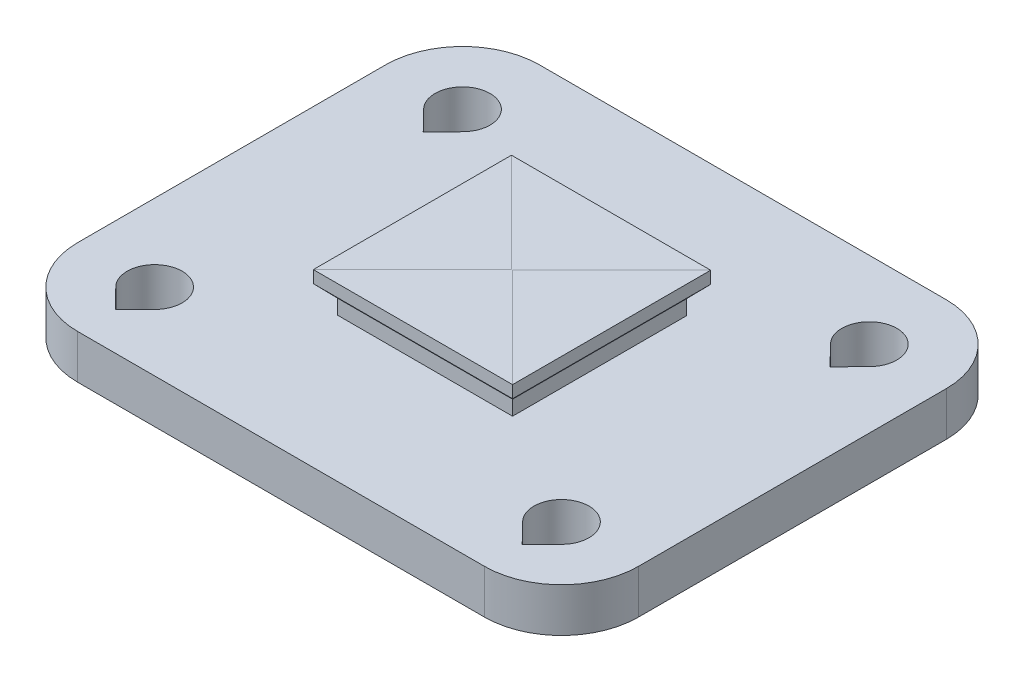
ISO-10303-21;
HEADER;
FILE_DESCRIPTION(('STEP AP214'),'2;1');
FILE_NAME('part.step','',(''),(''),'','','');
FILE_SCHEMA(('AUTOMOTIVE_DESIGN { 1 0 10303 214 1 1 1 1 }'));
ENDSEC;
DATA;
#1=APPLICATION_CONTEXT('core data for automotive mechanical design processes');
#2=APPLICATION_PROTOCOL_DEFINITION('international standard','automotive_design',2000,#1);
#3=PRODUCT_CONTEXT('',#1,'mechanical');
#4=PRODUCT('Part','Part','',(#3));
#5=PRODUCT_RELATED_PRODUCT_CATEGORY('part','',(#4));
#6=PRODUCT_DEFINITION_FORMATION('','',#4);
#7=PRODUCT_DEFINITION_CONTEXT('part definition',#1,'design');
#8=PRODUCT_DEFINITION('design','',#6,#7);
#9=PRODUCT_DEFINITION_SHAPE('','',#8);
#10=(LENGTH_UNIT() NAMED_UNIT(*) SI_UNIT(.MILLI.,.METRE.));
#11=(NAMED_UNIT(*) PLANE_ANGLE_UNIT() SI_UNIT($,.RADIAN.));
#12=(NAMED_UNIT(*) SI_UNIT($,.STERADIAN.) SOLID_ANGLE_UNIT());
#13=UNCERTAINTY_MEASURE_WITH_UNIT(LENGTH_MEASURE(1.E-05),#10,'distance_accuracy_value','');
#14=(GEOMETRIC_REPRESENTATION_CONTEXT(3) GLOBAL_UNCERTAINTY_ASSIGNED_CONTEXT((#13)) GLOBAL_UNIT_ASSIGNED_CONTEXT((#10,
#11,#12)) REPRESENTATION_CONTEXT('',''));
#15=CARTESIAN_POINT('',(0.,0.,0.));
#16=DIRECTION('',(0.,0.,1.));
#17=DIRECTION('',(1.,0.,0.));
#18=AXIS2_PLACEMENT_3D('',#15,#16,#17);
#19=CARTESIAN_POINT('',(18.5,4.211074047634,-10.42685295164));
#20=DIRECTION('',(0.714472679633082,0.,0.699663340513081));
#21=DIRECTION('',(0.,-1.,0.));
#22=AXIS2_PLACEMENT_3D('',#19,#20,#21);
#23=PLANE('',#22);
#24=DIRECTION('',(0.,-1.,0.));
#25=VECTOR('',#24,1.);
#26=CARTESIAN_POINT('',(18.5,0.2,-10.42685295164));
#27=LINE('',#26,#25);
#28=CARTESIAN_POINT('',(18.5,0.2,-10.42685295164));
#29=VERTEX_POINT('',#28);
#30=CARTESIAN_POINT('',(18.5,-3.8,-10.42685295164));
#31=VERTEX_POINT('',#30);
#32=EDGE_CURVE('E9',#29,#31,#27,.T.);
#33=ORIENTED_EDGE('',*,*,#32,.F.);
#34=DIRECTION('',(0.699663340513081,0.,-0.714472679633082));
#35=VECTOR('',#34,1.);
#36=CARTESIAN_POINT('',(18.5,0.2,-10.42685295164));
#37=LINE('',#36,#35);
#38=CARTESIAN_POINT('',(20.286181699082,0.2,-12.25084164871));
#39=VERTEX_POINT('',#38);
#40=EDGE_CURVE('E319',#29,#39,#37,.T.);
#41=ORIENTED_EDGE('',*,*,#40,.T.);
#42=DIRECTION('',(0.,-1.,0.));
#43=VECTOR('',#42,1.);
#44=CARTESIAN_POINT('',(20.286181699082,0.2,-12.25084164871));
#45=LINE('',#44,#43);
#46=CARTESIAN_POINT('',(20.286181699082,-3.8,-12.25084164871));
#47=VERTEX_POINT('',#46);
#48=EDGE_CURVE('E192',#39,#47,#45,.T.);
#49=ORIENTED_EDGE('',*,*,#48,.T.);
#50=DIRECTION('',(0.699663340513081,0.,-0.714472679633082));
#51=VECTOR('',#50,1.);
#52=CARTESIAN_POINT('',(18.5,-3.8,-10.42685295164));
#53=LINE('',#52,#51);
#54=EDGE_CURVE('E371',#31,#47,#53,.T.);
#55=ORIENTED_EDGE('',*,*,#54,.F.);
#56=EDGE_LOOP('',(#33,#41,#49,#55));
#57=FACE_BOUND('',#56,.T.);
#58=ADVANCED_FACE('F15',(#57),#23,.F.);
#59=CARTESIAN_POINT('',(16.713818300918,4.211074047634,-12.25084164871));
#60=DIRECTION('',(-0.714472679633082,0.,0.699663340513081));
#61=DIRECTION('',(0.,1.,0.));
#62=AXIS2_PLACEMENT_3D('',#59,#60,#61);
#63=PLANE('',#62);
#64=DIRECTION('',(0.,-1.,0.));
#65=VECTOR('',#64,1.);
#66=CARTESIAN_POINT('',(16.713818300918,0.2,-12.25084164871));
#67=LINE('',#66,#65);
#68=CARTESIAN_POINT('',(16.713818300918,0.2,-12.25084164871));
#69=VERTEX_POINT('',#68);
#70=CARTESIAN_POINT('',(16.713818300918,-3.8,-12.25084164871));
#71=VERTEX_POINT('',#70);
#72=EDGE_CURVE('E260',#69,#71,#67,.T.);
#73=ORIENTED_EDGE('',*,*,#72,.F.);
#74=DIRECTION('',(0.699663340513081,0.,0.714472679633082));
#75=VECTOR('',#74,1.);
#76=CARTESIAN_POINT('',(16.713818300918,0.2,-12.25084164871));
#77=LINE('',#76,#75);
#78=EDGE_CURVE('E312',#69,#29,#77,.T.);
#79=ORIENTED_EDGE('',*,*,#78,.T.);
#80=ORIENTED_EDGE('',*,*,#32,.T.);
#81=DIRECTION('',(0.699663340513081,0.,0.714472679633082));
#82=VECTOR('',#81,1.);
#83=CARTESIAN_POINT('',(16.713818300918,-3.8,-12.25084164871));
#84=LINE('',#83,#82);
#85=EDGE_CURVE('E211',#71,#31,#84,.T.);
#86=ORIENTED_EDGE('',*,*,#85,.F.);
#87=EDGE_LOOP('',(#73,#79,#80,#86));
#88=FACE_BOUND('',#87,.T.);
#89=ADVANCED_FACE('F388',(#88),#63,.F.);
#90=CARTESIAN_POINT('',(18.5,4.211074047634,17.573147048358));
#91=DIRECTION('',(0.714472679633082,0.,0.699663340513081));
#92=DIRECTION('',(0.,-1.,0.));
#93=AXIS2_PLACEMENT_3D('',#90,#91,#92);
#94=PLANE('',#93);
#95=DIRECTION('',(0.,-1.,0.));
#96=VECTOR('',#95,1.);
#97=CARTESIAN_POINT('',(18.5,0.2,17.573147048358));
#98=LINE('',#97,#96);
#99=CARTESIAN_POINT('',(18.5,0.2,17.573147048358));
#100=VERTEX_POINT('',#99);
#101=CARTESIAN_POINT('',(18.5,-3.8,17.573147048358));
#102=VERTEX_POINT('',#101);
#103=EDGE_CURVE('E24',#100,#102,#98,.T.);
#104=ORIENTED_EDGE('',*,*,#103,.F.);
#105=DIRECTION('',(0.699663340513081,0.,-0.714472679633082));
#106=VECTOR('',#105,1.);
#107=CARTESIAN_POINT('',(18.5,0.2,17.573147048358));
#108=LINE('',#107,#106);
#109=CARTESIAN_POINT('',(20.286181699082,0.2,15.749158351283));
#110=VERTEX_POINT('',#109);
#111=EDGE_CURVE('E315',#100,#110,#108,.T.);
#112=ORIENTED_EDGE('',*,*,#111,.T.);
#113=DIRECTION('',(0.,-1.,0.));
#114=VECTOR('',#113,1.);
#115=CARTESIAN_POINT('',(20.286181699082,0.2,15.749158351283));
#116=LINE('',#115,#114);
#117=CARTESIAN_POINT('',(20.286181699082,-3.8,15.749158351283));
#118=VERTEX_POINT('',#117);
#119=EDGE_CURVE('E193',#110,#118,#116,.T.);
#120=ORIENTED_EDGE('',*,*,#119,.T.);
#121=DIRECTION('',(0.699663340513081,0.,-0.714472679633082));
#122=VECTOR('',#121,1.);
#123=CARTESIAN_POINT('',(18.5,-3.8,17.573147048358));
#124=LINE('',#123,#122);
#125=EDGE_CURVE('E206',#102,#118,#124,.T.);
#126=ORIENTED_EDGE('',*,*,#125,.F.);
#127=EDGE_LOOP('',(#104,#112,#120,#126));
#128=FACE_BOUND('',#127,.T.);
#129=ADVANCED_FACE('F716',(#128),#94,.F.);
#130=CARTESIAN_POINT('',(16.713818300918,4.211074047634,15.749158351283));
#131=DIRECTION('',(-0.714472679633082,0.,0.699663340513081));
#132=DIRECTION('',(0.,1.,0.));
#133=AXIS2_PLACEMENT_3D('',#130,#131,#132);
#134=PLANE('',#133);
#135=DIRECTION('',(0.,-1.,0.));
#136=VECTOR('',#135,1.);
#137=CARTESIAN_POINT('',(16.713818300918,0.2,15.749158351283));
#138=LINE('',#137,#136);
#139=CARTESIAN_POINT('',(16.713818300918,0.2,15.749158351283));
#140=VERTEX_POINT('',#139);
#141=CARTESIAN_POINT('',(16.713818300918,-3.8,15.749158351283));
#142=VERTEX_POINT('',#141);
#143=EDGE_CURVE('E185',#140,#142,#138,.T.);
#144=ORIENTED_EDGE('',*,*,#143,.F.);
#145=DIRECTION('',(0.699663340513081,0.,0.714472679633082));
#146=VECTOR('',#145,1.);
#147=CARTESIAN_POINT('',(16.713818300918,0.2,15.749158351283));
#148=LINE('',#147,#146);
#149=EDGE_CURVE('E310',#140,#100,#148,.T.);
#150=ORIENTED_EDGE('',*,*,#149,.T.);
#151=ORIENTED_EDGE('',*,*,#103,.T.);
#152=DIRECTION('',(0.699663340513081,0.,0.714472679633082));
#153=VECTOR('',#152,1.);
#154=CARTESIAN_POINT('',(16.713818300918,-3.8,15.749158351283));
#155=LINE('',#154,#153);
#156=EDGE_CURVE('E197',#142,#102,#155,.T.);
#157=ORIENTED_EDGE('',*,*,#156,.F.);
#158=EDGE_LOOP('',(#144,#150,#151,#157));
#159=FACE_BOUND('',#158,.T.);
#160=ADVANCED_FACE('F196',(#159),#134,.F.);
#161=CARTESIAN_POINT('',(18.5,0.2,14.));
#162=DIRECTION('',(0.,-1.,0.));
#163=DIRECTION('',(0.,0.,-1.));
#164=AXIS2_PLACEMENT_3D('',#161,#162,#163);
#165=CYLINDRICAL_SURFACE('',#164,2.5);
#166=ORIENTED_EDGE('',*,*,#143,.T.);
#167=CARTESIAN_POINT('',(18.5,-3.8,14.));
#168=DIRECTION('',(0.,1.,0.));
#169=DIRECTION('',(-1.,0.,0.));
#170=AXIS2_PLACEMENT_3D('',#167,#168,#169);
#171=CIRCLE('',#170,2.5);
#172=EDGE_CURVE('E184',#118,#142,#171,.T.);
#173=ORIENTED_EDGE('',*,*,#172,.F.);
#174=ORIENTED_EDGE('',*,*,#119,.F.);
#175=CARTESIAN_POINT('',(18.5,0.2,14.));
#176=DIRECTION('',(0.,1.,0.));
#177=DIRECTION('',(-1.,0.,0.));
#178=AXIS2_PLACEMENT_3D('',#175,#176,#177);
#179=CIRCLE('',#178,2.5);
#180=EDGE_CURVE('E187',#110,#140,#179,.T.);
#181=ORIENTED_EDGE('',*,*,#180,.T.);
#182=EDGE_LOOP('',(#166,#173,#174,#181));
#183=FACE_BOUND('',#182,.T.);
#184=ADVANCED_FACE('F183',(#183),#165,.F.);
#185=CARTESIAN_POINT('',(18.5,0.2,14.));
#186=DIRECTION('',(0.,-1.,0.));
#187=DIRECTION('',(1.,0.,0.));
#188=AXIS2_PLACEMENT_3D('',#185,#186,#187);
#189=CYLINDRICAL_SURFACE('',#188,7.);
#190=CARTESIAN_POINT('',(18.5,-3.8,14.));
#191=DIRECTION('',(0.,1.,0.));
#192=DIRECTION('',(-1.,0.,0.));
#193=AXIS2_PLACEMENT_3D('',#190,#191,#192);
#194=CIRCLE('',#193,7.);
#195=CARTESIAN_POINT('',(18.5,-3.8,21.));
#196=VERTEX_POINT('',#195);
#197=CARTESIAN_POINT('',(25.5,-3.8,14.));
#198=VERTEX_POINT('',#197);
#199=EDGE_CURVE('E333',#196,#198,#194,.T.);
#200=ORIENTED_EDGE('',*,*,#199,.T.);
#201=DIRECTION('',(0.,-1.,0.));
#202=VECTOR('',#201,1.);
#203=CARTESIAN_POINT('',(25.5,0.2,14.));
#204=LINE('',#203,#202);
#205=CARTESIAN_POINT('',(25.5,0.2,14.));
#206=VERTEX_POINT('',#205);
#207=EDGE_CURVE('E255',#206,#198,#204,.T.);
#208=ORIENTED_EDGE('',*,*,#207,.F.);
#209=CARTESIAN_POINT('',(18.5,0.2,14.));
#210=DIRECTION('',(0.,1.,0.));
#211=DIRECTION('',(-1.,0.,0.));
#212=AXIS2_PLACEMENT_3D('',#209,#210,#211);
#213=CIRCLE('',#212,7.);
#214=CARTESIAN_POINT('',(18.5,0.2,21.));
#215=VERTEX_POINT('',#214);
#216=EDGE_CURVE('E397',#215,#206,#213,.T.);
#217=ORIENTED_EDGE('',*,*,#216,.F.);
#218=DIRECTION('',(0.,-1.,0.));
#219=VECTOR('',#218,1.);
#220=CARTESIAN_POINT('',(18.5,0.2,21.));
#221=LINE('',#220,#219);
#222=EDGE_CURVE('E241',#215,#196,#221,.T.);
#223=ORIENTED_EDGE('',*,*,#222,.T.);
#224=EDGE_LOOP('',(#200,#208,#217,#223));
#225=FACE_BOUND('',#224,.T.);
#226=ADVANCED_FACE('F729',(#225),#189,.T.);
#227=CARTESIAN_POINT('',(7.95,0.2,-9.274709182745));
#228=DIRECTION('',(-1.,0.,0.));
#229=DIRECTION('',(0.,0.,1.));
#230=AXIS2_PLACEMENT_3D('',#227,#228,#229);
#231=PLANE('',#230);
#232=DIRECTION('',(0.,-1.,0.));
#233=VECTOR('',#232,1.);
#234=CARTESIAN_POINT('',(7.95,1.540402622584,-7.9));
#235=LINE('',#234,#233);
#236=CARTESIAN_POINT('',(7.95,1.540402622584,-7.9));
#237=VERTEX_POINT('',#236);
#238=CARTESIAN_POINT('',(7.95,0.2,-7.9));
#239=VERTEX_POINT('',#238);
#240=EDGE_CURVE('E244',#237,#239,#235,.T.);
#241=ORIENTED_EDGE('',*,*,#240,.F.);
#242=DIRECTION('',(0.,0.,1.));
#243=VECTOR('',#242,1.);
#244=CARTESIAN_POINT('',(7.95,1.540402622584,-7.9));
#245=LINE('',#244,#243);
#246=CARTESIAN_POINT('',(7.95,1.540402622584,7.9));
#247=VERTEX_POINT('',#246);
#248=EDGE_CURVE('E510',#237,#247,#245,.T.);
#249=ORIENTED_EDGE('',*,*,#248,.T.);
#250=DIRECTION('',(0.,-1.,0.));
#251=VECTOR('',#250,1.);
#252=CARTESIAN_POINT('',(7.95,1.540402622584,7.9));
#253=LINE('',#252,#251);
#254=CARTESIAN_POINT('',(7.95,0.2,7.9));
#255=VERTEX_POINT('',#254);
#256=EDGE_CURVE('E295',#247,#255,#253,.T.);
#257=ORIENTED_EDGE('',*,*,#256,.T.);
#258=DIRECTION('',(0.,0.,1.));
#259=VECTOR('',#258,1.);
#260=CARTESIAN_POINT('',(7.95,0.2,-7.9));
#261=LINE('',#260,#259);
#262=EDGE_CURVE('E301',#239,#255,#261,.T.);
#263=ORIENTED_EDGE('',*,*,#262,.F.);
#264=EDGE_LOOP('',(#241,#249,#257,#263));
#265=FACE_BOUND('',#264,.T.);
#266=ADVANCED_FACE('F733',(#265),#231,.F.);
#267=CARTESIAN_POINT('',(18.5,0.2,-14.));
#268=DIRECTION('',(0.,-1.,0.));
#269=DIRECTION('',(0.,0.,-1.));
#270=AXIS2_PLACEMENT_3D('',#267,#268,#269);
#271=CYLINDRICAL_SURFACE('',#270,2.5);
#272=ORIENTED_EDGE('',*,*,#72,.T.);
#273=CARTESIAN_POINT('',(18.5,-3.8,-14.));
#274=DIRECTION('',(0.,-1.,0.));
#275=DIRECTION('',(-1.,0.,0.));
#276=AXIS2_PLACEMENT_3D('',#273,#274,#275);
#277=CIRCLE('',#276,2.5);
#278=EDGE_CURVE('E374',#71,#47,#277,.T.);
#279=ORIENTED_EDGE('',*,*,#278,.T.);
#280=ORIENTED_EDGE('',*,*,#48,.F.);
#281=CARTESIAN_POINT('',(18.5,0.2,-14.));
#282=DIRECTION('',(0.,-1.,0.));
#283=DIRECTION('',(-1.,0.,0.));
#284=AXIS2_PLACEMENT_3D('',#281,#282,#283);
#285=CIRCLE('',#284,2.5);
#286=EDGE_CURVE('E317',#69,#39,#285,.T.);
#287=ORIENTED_EDGE('',*,*,#286,.F.);
#288=EDGE_LOOP('',(#272,#279,#280,#287));
#289=FACE_BOUND('',#288,.T.);
#290=ADVANCED_FACE('F391',(#289),#271,.F.);
#291=CARTESIAN_POINT('',(25.5,0.2,0.));
#292=DIRECTION('',(-1.,0.,0.));
#293=DIRECTION('',(0.,0.,1.));
#294=AXIS2_PLACEMENT_3D('',#291,#292,#293);
#295=PLANE('',#294);
#296=DIRECTION('',(0.,0.,1.));
#297=VECTOR('',#296,1.);
#298=CARTESIAN_POINT('',(25.5,-3.8,-14.));
#299=LINE('',#298,#297);
#300=CARTESIAN_POINT('',(25.5,-3.8,-14.));
#301=VERTEX_POINT('',#300);
#302=EDGE_CURVE('E332',#301,#198,#299,.T.);
#303=ORIENTED_EDGE('',*,*,#302,.F.);
#304=DIRECTION('',(0.,-1.,0.));
#305=VECTOR('',#304,1.);
#306=CARTESIAN_POINT('',(25.5,0.2,-14.));
#307=LINE('',#306,#305);
#308=CARTESIAN_POINT('',(25.5,0.2,-14.));
#309=VERTEX_POINT('',#308);
#310=EDGE_CURVE('E249',#309,#301,#307,.T.);
#311=ORIENTED_EDGE('',*,*,#310,.F.);
#312=DIRECTION('',(0.,0.,1.));
#313=VECTOR('',#312,1.);
#314=CARTESIAN_POINT('',(25.5,0.2,-14.));
#315=LINE('',#314,#313);
#316=EDGE_CURVE('E405',#309,#206,#315,.T.);
#317=ORIENTED_EDGE('',*,*,#316,.T.);
#318=ORIENTED_EDGE('',*,*,#207,.T.);
#319=EDGE_LOOP('',(#303,#311,#317,#318));
#320=FACE_BOUND('',#319,.T.);
#321=ADVANCED_FACE('F738',(#320),#295,.F.);
#322=CARTESIAN_POINT('',(18.5,0.2,-14.));
#323=DIRECTION('',(0.,-1.,0.));
#324=DIRECTION('',(1.,0.,0.));
#325=AXIS2_PLACEMENT_3D('',#322,#323,#324);
#326=CYLINDRICAL_SURFACE('',#325,7.);
#327=CARTESIAN_POINT('',(18.5,-3.8,-14.));
#328=DIRECTION('',(0.,-1.,0.));
#329=DIRECTION('',(-1.,0.,0.));
#330=AXIS2_PLACEMENT_3D('',#327,#328,#329);
#331=CIRCLE('',#330,7.);
#332=CARTESIAN_POINT('',(18.5,-3.8,-21.));
#333=VERTEX_POINT('',#332);
#334=EDGE_CURVE('E330',#333,#301,#331,.T.);
#335=ORIENTED_EDGE('',*,*,#334,.F.);
#336=DIRECTION('',(0.,-1.,0.));
#337=VECTOR('',#336,1.);
#338=CARTESIAN_POINT('',(18.5,0.2,-21.));
#339=LINE('',#338,#337);
#340=CARTESIAN_POINT('',(18.5,0.2,-21.));
#341=VERTEX_POINT('',#340);
#342=EDGE_CURVE('E220',#341,#333,#339,.T.);
#343=ORIENTED_EDGE('',*,*,#342,.F.);
#344=CARTESIAN_POINT('',(18.5,0.2,-14.));
#345=DIRECTION('',(0.,-1.,0.));
#346=DIRECTION('',(-1.,0.,0.));
#347=AXIS2_PLACEMENT_3D('',#344,#345,#346);
#348=CIRCLE('',#347,7.);
#349=EDGE_CURVE('E429',#341,#309,#348,.T.);
#350=ORIENTED_EDGE('',*,*,#349,.T.);
#351=ORIENTED_EDGE('',*,*,#310,.T.);
#352=EDGE_LOOP('',(#335,#343,#350,#351));
#353=FACE_BOUND('',#352,.T.);
#354=ADVANCED_FACE('F666',(#353),#326,.T.);
#355=CARTESIAN_POINT('',(-18.5,4.211074047634,-10.42685295164));
#356=DIRECTION('',(-0.714472679633082,0.,0.699663340513081));
#357=DIRECTION('',(0.,1.,0.));
#358=AXIS2_PLACEMENT_3D('',#355,#356,#357);
#359=PLANE('',#358);
#360=DIRECTION('',(0.,-1.,0.));
#361=VECTOR('',#360,1.);
#362=CARTESIAN_POINT('',(-18.5,0.2,-10.42685295164));
#363=LINE('',#362,#361);
#364=CARTESIAN_POINT('',(-18.5,0.2,-10.42685295164));
#365=VERTEX_POINT('',#364);
#366=CARTESIAN_POINT('',(-18.5,-3.8,-10.42685295164));
#367=VERTEX_POINT('',#366);
#368=EDGE_CURVE('E254',#365,#367,#363,.T.);
#369=ORIENTED_EDGE('',*,*,#368,.T.);
#370=DIRECTION('',(-0.699663340513081,0.,-0.714472679633082));
#371=VECTOR('',#370,1.);
#372=CARTESIAN_POINT('',(-18.5,-3.8,-10.42685295164));
#373=LINE('',#372,#371);
#374=CARTESIAN_POINT('',(-20.28618169908,-3.8,-12.25084164871));
#375=VERTEX_POINT('',#374);
#376=EDGE_CURVE('E355',#367,#375,#373,.T.);
#377=ORIENTED_EDGE('',*,*,#376,.T.);
#378=DIRECTION('',(0.,-1.,0.));
#379=VECTOR('',#378,1.);
#380=CARTESIAN_POINT('',(-20.28618169908,0.2,-12.25084164871));
#381=LINE('',#380,#379);
#382=CARTESIAN_POINT('',(-20.28618169908,0.2,-12.25084164871));
#383=VERTEX_POINT('',#382);
#384=EDGE_CURVE('E227',#383,#375,#381,.T.);
#385=ORIENTED_EDGE('',*,*,#384,.F.);
#386=DIRECTION('',(-0.699663340513081,0.,-0.714472679633082));
#387=VECTOR('',#386,1.);
#388=CARTESIAN_POINT('',(-18.5,0.2,-10.42685295164));
#389=LINE('',#388,#387);
#390=EDGE_CURVE('E283',#365,#383,#389,.T.);
#391=ORIENTED_EDGE('',*,*,#390,.F.);
#392=EDGE_LOOP('',(#369,#377,#385,#391));
#393=FACE_BOUND('',#392,.T.);
#394=ADVANCED_FACE('F744',(#393),#359,.F.);
#395=CARTESIAN_POINT('',(-16.71381830091,4.211074047634,-12.25084164871));
#396=DIRECTION('',(0.714472679633082,0.,0.699663340513081));
#397=DIRECTION('',(0.,-1.,0.));
#398=AXIS2_PLACEMENT_3D('',#395,#396,#397);
#399=PLANE('',#398);
#400=DIRECTION('',(0.,-1.,0.));
#401=VECTOR('',#400,1.);
#402=CARTESIAN_POINT('',(-16.71381830091,0.2,-12.25084164871));
#403=LINE('',#402,#401);
#404=CARTESIAN_POINT('',(-16.71381830091,0.2,-12.25084164871));
#405=VERTEX_POINT('',#404);
#406=CARTESIAN_POINT('',(-16.71381830091,-3.8,-12.25084164871));
#407=VERTEX_POINT('',#406);
#408=EDGE_CURVE('E221',#405,#407,#403,.T.);
#409=ORIENTED_EDGE('',*,*,#408,.T.);
#410=DIRECTION('',(-0.699663340513081,0.,0.714472679633082));
#411=VECTOR('',#410,1.);
#412=CARTESIAN_POINT('',(-16.71381830091,-3.8,-12.25084164871));
#413=LINE('',#412,#411);
#414=EDGE_CURVE('E356',#407,#367,#413,.T.);
#415=ORIENTED_EDGE('',*,*,#414,.T.);
#416=ORIENTED_EDGE('',*,*,#368,.F.);
#417=DIRECTION('',(-0.699663340513081,0.,0.714472679633082));
#418=VECTOR('',#417,1.);
#419=CARTESIAN_POINT('',(-16.71381830091,0.2,-12.25084164871));
#420=LINE('',#419,#418);
#421=EDGE_CURVE('E278',#405,#365,#420,.T.);
#422=ORIENTED_EDGE('',*,*,#421,.F.);
#423=EDGE_LOOP('',(#409,#415,#416,#422));
#424=FACE_BOUND('',#423,.T.);
#425=ADVANCED_FACE('F746',(#424),#399,.F.);
#426=CARTESIAN_POINT('',(-18.5,4.211074047634,17.573147048358));
#427=DIRECTION('',(-0.714472679633082,0.,0.699663340513081));
#428=DIRECTION('',(0.,1.,0.));
#429=AXIS2_PLACEMENT_3D('',#426,#427,#428);
#430=PLANE('',#429);
#431=DIRECTION('',(0.,-1.,0.));
#432=VECTOR('',#431,1.);
#433=CARTESIAN_POINT('',(-18.5,0.2,17.573147048358));
#434=LINE('',#433,#432);
#435=CARTESIAN_POINT('',(-18.5,0.2,17.573147048358));
#436=VERTEX_POINT('',#435);
#437=CARTESIAN_POINT('',(-18.5,-3.8,17.573147048358));
#438=VERTEX_POINT('',#437);
#439=EDGE_CURVE('E292',#436,#438,#434,.T.);
#440=ORIENTED_EDGE('',*,*,#439,.T.);
#441=DIRECTION('',(-0.699663340513081,0.,-0.714472679633082));
#442=VECTOR('',#441,1.);
#443=CARTESIAN_POINT('',(-18.5,-3.8,17.573147048358));
#444=LINE('',#443,#442);
#445=CARTESIAN_POINT('',(-20.28618169908,-3.8,15.749158351283));
#446=VERTEX_POINT('',#445);
#447=EDGE_CURVE('E365',#438,#446,#444,.T.);
#448=ORIENTED_EDGE('',*,*,#447,.T.);
#449=DIRECTION('',(0.,-1.,0.));
#450=VECTOR('',#449,1.);
#451=CARTESIAN_POINT('',(-20.28618169908,0.2,15.749158351283));
#452=LINE('',#451,#450);
#453=CARTESIAN_POINT('',(-20.28618169908,0.2,15.749158351283));
#454=VERTEX_POINT('',#453);
#455=EDGE_CURVE('E247',#454,#446,#452,.T.);
#456=ORIENTED_EDGE('',*,*,#455,.F.);
#457=DIRECTION('',(-0.699663340513081,0.,-0.714472679633082));
#458=VECTOR('',#457,1.);
#459=CARTESIAN_POINT('',(-18.5,0.2,17.573147048358));
#460=LINE('',#459,#458);
#461=EDGE_CURVE('E277',#436,#454,#460,.T.);
#462=ORIENTED_EDGE('',*,*,#461,.F.);
#463=EDGE_LOOP('',(#440,#448,#456,#462));
#464=FACE_BOUND('',#463,.T.);
#465=ADVANCED_FACE('F755',(#464),#430,.F.);
#466=CARTESIAN_POINT('',(-16.71381830091,4.211074047634,15.749158351283));
#467=DIRECTION('',(0.714472679633082,0.,0.699663340513081));
#468=DIRECTION('',(0.,-1.,0.));
#469=AXIS2_PLACEMENT_3D('',#466,#467,#468);
#470=PLANE('',#469);
#471=DIRECTION('',(0.,-1.,0.));
#472=VECTOR('',#471,1.);
#473=CARTESIAN_POINT('',(-16.71381830091,0.2,15.749158351283));
#474=LINE('',#473,#472);
#475=CARTESIAN_POINT('',(-16.71381830091,0.2,15.749158351283));
#476=VERTEX_POINT('',#475);
#477=CARTESIAN_POINT('',(-16.71381830091,-3.8,15.749158351283));
#478=VERTEX_POINT('',#477);
#479=EDGE_CURVE('E246',#476,#478,#474,.T.);
#480=ORIENTED_EDGE('',*,*,#479,.T.);
#481=DIRECTION('',(-0.699663340513081,0.,0.714472679633082));
#482=VECTOR('',#481,1.);
#483=CARTESIAN_POINT('',(-16.71381830091,-3.8,15.749158351283));
#484=LINE('',#483,#482);
#485=EDGE_CURVE('E366',#478,#438,#484,.T.);
#486=ORIENTED_EDGE('',*,*,#485,.T.);
#487=ORIENTED_EDGE('',*,*,#439,.F.);
#488=DIRECTION('',(-0.699663340513081,0.,0.714472679633082));
#489=VECTOR('',#488,1.);
#490=CARTESIAN_POINT('',(-16.71381830091,0.2,15.749158351283));
#491=LINE('',#490,#489);
#492=EDGE_CURVE('E402',#476,#436,#491,.T.);
#493=ORIENTED_EDGE('',*,*,#492,.F.);
#494=EDGE_LOOP('',(#480,#486,#487,#493));
#495=FACE_BOUND('',#494,.T.);
#496=ADVANCED_FACE('F756',(#495),#470,.F.);
#497=CARTESIAN_POINT('',(0.,0.2,7.9));
#498=DIRECTION('',(0.,0.,-1.));
#499=DIRECTION('',(0.,-1.,0.));
#500=AXIS2_PLACEMENT_3D('',#497,#498,#499);
#501=PLANE('',#500);
#502=DIRECTION('',(-1.,0.,0.));
#503=VECTOR('',#502,1.);
#504=CARTESIAN_POINT('',(7.95,1.540402622584,7.9));
#505=LINE('',#504,#503);
#506=CARTESIAN_POINT('',(-7.95,1.540402622584,7.9));
#507=VERTEX_POINT('',#506);
#508=EDGE_CURVE('E430',#247,#507,#505,.T.);
#509=ORIENTED_EDGE('',*,*,#508,.T.);
#510=DIRECTION('',(0.,-1.,0.));
#511=VECTOR('',#510,1.);
#512=CARTESIAN_POINT('',(-7.95,1.540402622584,7.9));
#513=LINE('',#512,#511);
#514=CARTESIAN_POINT('',(-7.95,0.2,7.9));
#515=VERTEX_POINT('',#514);
#516=EDGE_CURVE('E231',#507,#515,#513,.T.);
#517=ORIENTED_EDGE('',*,*,#516,.T.);
#518=DIRECTION('',(-1.,0.,0.));
#519=VECTOR('',#518,1.);
#520=CARTESIAN_POINT('',(7.95,0.2,7.9));
#521=LINE('',#520,#519);
#522=EDGE_CURVE('E304',#255,#515,#521,.T.);
#523=ORIENTED_EDGE('',*,*,#522,.F.);
#524=ORIENTED_EDGE('',*,*,#256,.F.);
#525=EDGE_LOOP('',(#509,#517,#523,#524));
#526=FACE_BOUND('',#525,.T.);
#527=ADVANCED_FACE('F759',(#526),#501,.F.);
#528=CARTESIAN_POINT('',(-18.5,0.2,14.));
#529=DIRECTION('',(0.,-1.,0.));
#530=DIRECTION('',(0.,0.,-1.));
#531=AXIS2_PLACEMENT_3D('',#528,#529,#530);
#532=CYLINDRICAL_SURFACE('',#531,2.5);
#533=ORIENTED_EDGE('',*,*,#479,.F.);
#534=CARTESIAN_POINT('',(-18.5,0.2,14.));
#535=DIRECTION('',(0.,-1.,0.));
#536=DIRECTION('',(1.,0.,0.));
#537=AXIS2_PLACEMENT_3D('',#534,#535,#536);
#538=CIRCLE('',#537,2.5);
#539=EDGE_CURVE('E285',#454,#476,#538,.T.);
#540=ORIENTED_EDGE('',*,*,#539,.F.);
#541=ORIENTED_EDGE('',*,*,#455,.T.);
#542=CARTESIAN_POINT('',(-18.5,-3.8,14.));
#543=DIRECTION('',(0.,-1.,0.));
#544=DIRECTION('',(1.,0.,0.));
#545=AXIS2_PLACEMENT_3D('',#542,#543,#544);
#546=CIRCLE('',#545,2.5);
#547=EDGE_CURVE('E376',#446,#478,#546,.T.);
#548=ORIENTED_EDGE('',*,*,#547,.T.);
#549=EDGE_LOOP('',(#533,#540,#541,#548));
#550=FACE_BOUND('',#549,.T.);
#551=ADVANCED_FACE('F762',(#550),#532,.F.);
#552=CARTESIAN_POINT('',(-18.5,0.2,14.));
#553=DIRECTION('',(0.,-1.,0.));
#554=DIRECTION('',(-1.,0.,0.));
#555=AXIS2_PLACEMENT_3D('',#552,#553,#554);
#556=CYLINDRICAL_SURFACE('',#555,7.);
#557=CARTESIAN_POINT('',(-18.5,-3.8,14.));
#558=DIRECTION('',(0.,-1.,0.));
#559=DIRECTION('',(1.,0.,0.));
#560=AXIS2_PLACEMENT_3D('',#557,#558,#559);
#561=CIRCLE('',#560,7.);
#562=CARTESIAN_POINT('',(-18.5,-3.8,21.));
#563=VERTEX_POINT('',#562);
#564=CARTESIAN_POINT('',(-25.5,-3.8,14.));
#565=VERTEX_POINT('',#564);
#566=EDGE_CURVE('E340',#563,#565,#561,.T.);
#567=ORIENTED_EDGE('',*,*,#566,.F.);
#568=DIRECTION('',(0.,-1.,0.));
#569=VECTOR('',#568,1.);
#570=CARTESIAN_POINT('',(-18.5,0.2,21.));
#571=LINE('',#570,#569);
#572=CARTESIAN_POINT('',(-18.5,0.2,21.));
#573=VERTEX_POINT('',#572);
#574=EDGE_CURVE('E243',#573,#563,#571,.T.);
#575=ORIENTED_EDGE('',*,*,#574,.F.);
#576=CARTESIAN_POINT('',(-18.5,0.2,14.));
#577=DIRECTION('',(0.,-1.,0.));
#578=DIRECTION('',(1.,0.,0.));
#579=AXIS2_PLACEMENT_3D('',#576,#577,#578);
#580=CIRCLE('',#579,7.);
#581=CARTESIAN_POINT('',(-25.5,0.2,14.));
#582=VERTEX_POINT('',#581);
#583=EDGE_CURVE('E449',#573,#582,#580,.T.);
#584=ORIENTED_EDGE('',*,*,#583,.T.);
#585=DIRECTION('',(0.,-1.,0.));
#586=VECTOR('',#585,1.);
#587=CARTESIAN_POINT('',(-25.5,0.2,14.));
#588=LINE('',#587,#586);
#589=EDGE_CURVE('E224',#582,#565,#588,.T.);
#590=ORIENTED_EDGE('',*,*,#589,.T.);
#591=EDGE_LOOP('',(#567,#575,#584,#590));
#592=FACE_BOUND('',#591,.T.);
#593=ADVANCED_FACE('F466',(#592),#556,.T.);
#594=CARTESIAN_POINT('',(0.,0.2,21.));
#595=DIRECTION('',(0.,0.,-1.));
#596=DIRECTION('',(0.,-1.,0.));
#597=AXIS2_PLACEMENT_3D('',#594,#595,#596);
#598=PLANE('',#597);
#599=DIRECTION('',(-1.,0.,0.));
#600=VECTOR('',#599,1.);
#601=CARTESIAN_POINT('',(18.5,-3.8,21.));
#602=LINE('',#601,#600);
#603=EDGE_CURVE('E336',#196,#563,#602,.T.);
#604=ORIENTED_EDGE('',*,*,#603,.F.);
#605=ORIENTED_EDGE('',*,*,#222,.F.);
#606=DIRECTION('',(-1.,0.,0.));
#607=VECTOR('',#606,1.);
#608=CARTESIAN_POINT('',(18.5,0.2,21.));
#609=LINE('',#608,#607);
#610=EDGE_CURVE('E455',#215,#573,#609,.T.);
#611=ORIENTED_EDGE('',*,*,#610,.T.);
#612=ORIENTED_EDGE('',*,*,#574,.T.);
#613=EDGE_LOOP('',(#604,#605,#611,#612));
#614=FACE_BOUND('',#613,.T.);
#615=ADVANCED_FACE('F461',(#614),#598,.F.);
#616=CARTESIAN_POINT('',(0.,1.540402622584,-7.9));
#617=DIRECTION('',(0.,0.694658370458825,0.719339800338818));
#618=DIRECTION('',(1.,0.,0.));
#619=AXIS2_PLACEMENT_3D('',#616,#617,#618);
#620=PLANE('',#619);
#621=DIRECTION('',(1.,0.,0.));
#622=VECTOR('',#621,1.);
#623=CARTESIAN_POINT('',(4.5295,2.688805740579,-9.009000000001));
#624=LINE('',#623,#622);
#625=CARTESIAN_POINT('',(-9.059,2.688805740577,-9.009000000001));
#626=VERTEX_POINT('',#625);
#627=CARTESIAN_POINT('',(9.059000000001,2.688805740579,-9.009000000001));
#628=VERTEX_POINT('',#627);
#629=EDGE_CURVE('E514',#626,#628,#624,.T.);
#630=ORIENTED_EDGE('',*,*,#629,.T.);
#631=DIRECTION('',(-0.570514335805256,-0.590784889178265,0.570514335805256));
#632=VECTOR('',#631,1.);
#633=CARTESIAN_POINT('',(9.108826529768,2.740402622584,-9.058826529768));
#634=LINE('',#633,#632);
#635=EDGE_CURVE('E515',#628,#237,#634,.T.);
#636=ORIENTED_EDGE('',*,*,#635,.T.);
#637=DIRECTION('',(-1.,0.,0.));
#638=VECTOR('',#637,1.);
#639=CARTESIAN_POINT('',(7.95,1.540402622584,-7.9));
#640=LINE('',#639,#638);
#641=CARTESIAN_POINT('',(-7.95,1.540402622584,-7.9));
#642=VERTEX_POINT('',#641);
#643=EDGE_CURVE('E279',#237,#642,#640,.T.);
#644=ORIENTED_EDGE('',*,*,#643,.T.);
#645=DIRECTION('',(0.570514335805256,-0.590784889178265,0.570514335805256));
#646=VECTOR('',#645,1.);
#647=CARTESIAN_POINT('',(-9.108826529768,2.740402622584,-9.058826529768));
#648=LINE('',#647,#646);
#649=EDGE_CURVE('E237',#626,#642,#648,.T.);
#650=ORIENTED_EDGE('',*,*,#649,.F.);
#651=EDGE_LOOP('',(#630,#636,#644,#650));
#652=FACE_BOUND('',#651,.T.);
#653=ADVANCED_FACE('F775',(#652),#620,.F.);
#654=CARTESIAN_POINT('',(0.,3.8,-9.058826529768));
#655=DIRECTION('',(0.,-1.,0.));
#656=DIRECTION('',(0.,0.,-1.));
#657=AXIS2_PLACEMENT_3D('',#654,#655,#656);
#658=PLANE('',#657);
#659=DIRECTION('',(1.,0.,0.));
#660=VECTOR('',#659,1.);
#661=CARTESIAN_POINT('',(-4.5295,3.8,9.008999999999));
#662=LINE('',#661,#660);
#663=CARTESIAN_POINT('',(-9.058999999999,3.8,9.008999999999));
#664=VERTEX_POINT('',#663);
#665=CARTESIAN_POINT('',(9.059000000001,3.8,9.008999999999));
#666=VERTEX_POINT('',#665);
#667=EDGE_CURVE('E490',#664,#666,#662,.T.);
#668=ORIENTED_EDGE('',*,*,#667,.T.);
#669=DIRECTION('',(0.707106781186548,0.,0.707106781186548));
#670=VECTOR('',#669,1.);
#671=CARTESIAN_POINT('',(0.05,3.8,0.));
#672=LINE('',#671,#670);
#673=CARTESIAN_POINT('',(0.05,3.8,0.));
#674=VERTEX_POINT('',#673);
#675=EDGE_CURVE('E535',#674,#666,#672,.T.);
#676=ORIENTED_EDGE('',*,*,#675,.F.);
#677=DIRECTION('',(0.707106781186548,0.,-0.707106781186548));
#678=VECTOR('',#677,1.);
#679=CARTESIAN_POINT('',(0.05,3.8,0.));
#680=LINE('',#679,#678);
#681=CARTESIAN_POINT('',(9.059000000001,3.8,-9.009000000001));
#682=VERTEX_POINT('',#681);
#683=EDGE_CURVE('E526',#674,#682,#680,.T.);
#684=ORIENTED_EDGE('',*,*,#683,.T.);
#685=DIRECTION('',(-1.,0.,0.));
#686=VECTOR('',#685,1.);
#687=CARTESIAN_POINT('',(4.5295,3.8,-9.009000000001));
#688=LINE('',#687,#686);
#689=CARTESIAN_POINT('',(-9.059,3.8,-9.009000000001));
#690=VERTEX_POINT('',#689);
#691=EDGE_CURVE('E525',#682,#690,#688,.T.);
#692=ORIENTED_EDGE('',*,*,#691,.T.);
#693=DIRECTION('',(-0.707106781186548,0.,-0.707106781186548));
#694=VECTOR('',#693,1.);
#695=CARTESIAN_POINT('',(-0.05,3.8,0.));
#696=LINE('',#695,#694);
#697=CARTESIAN_POINT('',(-0.05,3.8,0.));
#698=VERTEX_POINT('',#697);
#699=EDGE_CURVE('E38',#698,#690,#696,.T.);
#700=ORIENTED_EDGE('',*,*,#699,.F.);
#701=DIRECTION('',(-0.707106781186548,0.,0.707106781186548));
#702=VECTOR('',#701,1.);
#703=CARTESIAN_POINT('',(-0.05,3.8,0.));
#704=LINE('',#703,#702);
#705=EDGE_CURVE('E239',#698,#664,#704,.T.);
#706=ORIENTED_EDGE('',*,*,#705,.T.);
#707=EDGE_LOOP('',(#668,#676,#684,#692,#700,#706));
#708=FACE_BOUND('',#707,.T.);
#709=ADVANCED_FACE('F700',(#708),#658,.F.);
#710=CARTESIAN_POINT('',(0.,0.2,-7.9));
#711=DIRECTION('',(0.,0.,1.));
#712=DIRECTION('',(1.,0.,0.));
#713=AXIS2_PLACEMENT_3D('',#710,#711,#712);
#714=PLANE('',#713);
#715=ORIENTED_EDGE('',*,*,#643,.F.);
#716=ORIENTED_EDGE('',*,*,#240,.T.);
#717=DIRECTION('',(-1.,0.,0.));
#718=VECTOR('',#717,1.);
#719=CARTESIAN_POINT('',(7.95,0.2,-7.9));
#720=LINE('',#719,#718);
#721=CARTESIAN_POINT('',(-7.95,0.2,-7.9));
#722=VERTEX_POINT('',#721);
#723=EDGE_CURVE('E300',#239,#722,#720,.T.);
#724=ORIENTED_EDGE('',*,*,#723,.T.);
#725=DIRECTION('',(0.,-1.,0.));
#726=VECTOR('',#725,1.);
#727=CARTESIAN_POINT('',(-7.95,1.540402622584,-7.9));
#728=LINE('',#727,#726);
#729=EDGE_CURVE('E230',#642,#722,#728,.T.);
#730=ORIENTED_EDGE('',*,*,#729,.F.);
#731=EDGE_LOOP('',(#715,#716,#724,#730));
#732=FACE_BOUND('',#731,.T.);
#733=ADVANCED_FACE('F564',(#732),#714,.F.);
#734=CARTESIAN_POINT('',(-7.95,1.540402622584,-9.274709182745));
#735=DIRECTION('',(0.719339800338818,0.694658370458825,0.));
#736=DIRECTION('',(0.,0.,-1.));
#737=AXIS2_PLACEMENT_3D('',#734,#735,#736);
#738=PLANE('',#737);
#739=DIRECTION('',(0.,0.,-1.));
#740=VECTOR('',#739,1.);
#741=CARTESIAN_POINT('',(-9.059,2.688805740577,-9.141854591373));
#742=LINE('',#741,#740);
#743=CARTESIAN_POINT('',(-9.058999999999,2.688805740577,9.008999999999));
#744=VERTEX_POINT('',#743);
#745=EDGE_CURVE('E494',#744,#626,#742,.T.);
#746=ORIENTED_EDGE('',*,*,#745,.T.);
#747=ORIENTED_EDGE('',*,*,#649,.T.);
#748=DIRECTION('',(0.,0.,1.));
#749=VECTOR('',#748,1.);
#750=CARTESIAN_POINT('',(-7.95,1.540402622584,-7.9));
#751=LINE('',#750,#749);
#752=EDGE_CURVE('E232',#642,#507,#751,.T.);
#753=ORIENTED_EDGE('',*,*,#752,.T.);
#754=DIRECTION('',(0.570514335805256,-0.590784889178265,-0.570514335805256));
#755=VECTOR('',#754,1.);
#756=CARTESIAN_POINT('',(-9.108826529768,2.740402622584,9.058826529768));
#757=LINE('',#756,#755);
#758=EDGE_CURVE('E422',#744,#507,#757,.T.);
#759=ORIENTED_EDGE('',*,*,#758,.F.);
#760=EDGE_LOOP('',(#746,#747,#753,#759));
#761=FACE_BOUND('',#760,.T.);
#762=ADVANCED_FACE('F549',(#761),#738,.F.);
#763=CARTESIAN_POINT('',(-9.108826529768,3.8,-9.274709182745));
#764=DIRECTION('',(0.,-1.,0.));
#765=DIRECTION('',(0.,0.,-1.));
#766=AXIS2_PLACEMENT_3D('',#763,#764,#765);
#767=PLANE('',#766);
#768=DIRECTION('',(0.,0.,1.));
#769=VECTOR('',#768,1.);
#770=CARTESIAN_POINT('',(-9.059,3.8,-9.141854591373));
#771=LINE('',#770,#769);
#772=EDGE_CURVE('E496',#690,#664,#771,.T.);
#773=ORIENTED_EDGE('',*,*,#772,.T.);
#774=ORIENTED_EDGE('',*,*,#705,.F.);
#775=ORIENTED_EDGE('',*,*,#699,.T.);
#776=EDGE_LOOP('',(#773,#774,#775));
#777=FACE_BOUND('',#776,.T.);
#778=ADVANCED_FACE('F695',(#777),#767,.F.);
#779=CARTESIAN_POINT('',(-7.95,0.2,-9.274709182745));
#780=DIRECTION('',(1.,0.,0.));
#781=DIRECTION('',(0.,0.,-1.));
#782=AXIS2_PLACEMENT_3D('',#779,#780,#781);
#783=PLANE('',#782);
#784=ORIENTED_EDGE('',*,*,#729,.T.);
#785=DIRECTION('',(0.,0.,1.));
#786=VECTOR('',#785,1.);
#787=CARTESIAN_POINT('',(-7.95,0.2,-7.9));
#788=LINE('',#787,#786);
#789=EDGE_CURVE('E289',#722,#515,#788,.T.);
#790=ORIENTED_EDGE('',*,*,#789,.T.);
#791=ORIENTED_EDGE('',*,*,#516,.F.);
#792=ORIENTED_EDGE('',*,*,#752,.F.);
#793=EDGE_LOOP('',(#784,#790,#791,#792));
#794=FACE_BOUND('',#793,.T.);
#795=ADVANCED_FACE('F561',(#794),#783,.F.);
#796=CARTESIAN_POINT('',(-18.5,0.2,-14.));
#797=DIRECTION('',(0.,-1.,0.));
#798=DIRECTION('',(0.,0.,-1.));
#799=AXIS2_PLACEMENT_3D('',#796,#797,#798);
#800=CYLINDRICAL_SURFACE('',#799,2.5);
#801=ORIENTED_EDGE('',*,*,#408,.F.);
#802=CARTESIAN_POINT('',(-18.5,0.2,-14.));
#803=DIRECTION('',(0.,1.,0.));
#804=DIRECTION('',(1.,0.,0.));
#805=AXIS2_PLACEMENT_3D('',#802,#803,#804);
#806=CIRCLE('',#805,2.5);
#807=EDGE_CURVE('E286',#405,#383,#806,.T.);
#808=ORIENTED_EDGE('',*,*,#807,.T.);
#809=ORIENTED_EDGE('',*,*,#384,.T.);
#810=CARTESIAN_POINT('',(-18.5,-3.8,-14.));
#811=DIRECTION('',(0.,1.,0.));
#812=DIRECTION('',(1.,0.,0.));
#813=AXIS2_PLACEMENT_3D('',#810,#811,#812);
#814=CIRCLE('',#813,2.5);
#815=EDGE_CURVE('E359',#407,#375,#814,.T.);
#816=ORIENTED_EDGE('',*,*,#815,.F.);
#817=EDGE_LOOP('',(#801,#808,#809,#816));
#818=FACE_BOUND('',#817,.T.);
#819=ADVANCED_FACE('F783',(#818),#800,.F.);
#820=CARTESIAN_POINT('',(-25.5,0.2,0.));
#821=DIRECTION('',(1.,0.,0.));
#822=DIRECTION('',(0.,1.,0.));
#823=AXIS2_PLACEMENT_3D('',#820,#821,#822);
#824=PLANE('',#823);
#825=DIRECTION('',(0.,0.,1.));
#826=VECTOR('',#825,1.);
#827=CARTESIAN_POINT('',(-25.5,-3.8,-14.));
#828=LINE('',#827,#826);
#829=CARTESIAN_POINT('',(-25.5,-3.8,-14.));
#830=VERTEX_POINT('',#829);
#831=EDGE_CURVE('E342',#830,#565,#828,.T.);
#832=ORIENTED_EDGE('',*,*,#831,.T.);
#833=ORIENTED_EDGE('',*,*,#589,.F.);
#834=DIRECTION('',(0.,0.,1.));
#835=VECTOR('',#834,1.);
#836=CARTESIAN_POINT('',(-25.5,0.2,-14.));
#837=LINE('',#836,#835);
#838=CARTESIAN_POINT('',(-25.5,0.2,-14.));
#839=VERTEX_POINT('',#838);
#840=EDGE_CURVE('E441',#839,#582,#837,.T.);
#841=ORIENTED_EDGE('',*,*,#840,.F.);
#842=DIRECTION('',(0.,-1.,0.));
#843=VECTOR('',#842,1.);
#844=CARTESIAN_POINT('',(-25.5,0.2,-14.));
#845=LINE('',#844,#843);
#846=EDGE_CURVE('E219',#839,#830,#845,.T.);
#847=ORIENTED_EDGE('',*,*,#846,.T.);
#848=EDGE_LOOP('',(#832,#833,#841,#847));
#849=FACE_BOUND('',#848,.T.);
#850=ADVANCED_FACE('F649',(#849),#824,.F.);
#851=CARTESIAN_POINT('',(-18.5,0.2,-14.));
#852=DIRECTION('',(0.,-1.,0.));
#853=DIRECTION('',(-1.,0.,0.));
#854=AXIS2_PLACEMENT_3D('',#851,#852,#853);
#855=CYLINDRICAL_SURFACE('',#854,7.);
#856=CARTESIAN_POINT('',(-18.5,-3.8,-14.));
#857=DIRECTION('',(0.,1.,0.));
#858=DIRECTION('',(1.,0.,0.));
#859=AXIS2_PLACEMENT_3D('',#856,#857,#858);
#860=CIRCLE('',#859,7.);
#861=CARTESIAN_POINT('',(-18.5,-3.8,-21.));
#862=VERTEX_POINT('',#861);
#863=EDGE_CURVE('E348',#862,#830,#860,.T.);
#864=ORIENTED_EDGE('',*,*,#863,.T.);
#865=ORIENTED_EDGE('',*,*,#846,.F.);
#866=CARTESIAN_POINT('',(-18.5,0.2,-14.));
#867=DIRECTION('',(0.,1.,0.));
#868=DIRECTION('',(1.,0.,0.));
#869=AXIS2_PLACEMENT_3D('',#866,#867,#868);
#870=CIRCLE('',#869,7.);
#871=CARTESIAN_POINT('',(-18.5,0.2,-21.));
#872=VERTEX_POINT('',#871);
#873=EDGE_CURVE('E439',#872,#839,#870,.T.);
#874=ORIENTED_EDGE('',*,*,#873,.F.);
#875=DIRECTION('',(0.,-1.,0.));
#876=VECTOR('',#875,1.);
#877=CARTESIAN_POINT('',(-18.5,0.2,-21.));
#878=LINE('',#877,#876);
#879=EDGE_CURVE('E205',#872,#862,#878,.T.);
#880=ORIENTED_EDGE('',*,*,#879,.T.);
#881=EDGE_LOOP('',(#864,#865,#874,#880));
#882=FACE_BOUND('',#881,.T.);
#883=ADVANCED_FACE('F656',(#882),#855,.T.);
#884=CARTESIAN_POINT('',(0.,0.2,-21.));
#885=DIRECTION('',(0.,0.,1.));
#886=DIRECTION('',(1.,0.,0.));
#887=AXIS2_PLACEMENT_3D('',#884,#885,#886);
#888=PLANE('',#887);
#889=DIRECTION('',(-1.,0.,0.));
#890=VECTOR('',#889,1.);
#891=CARTESIAN_POINT('',(18.5,-3.8,-21.));
#892=LINE('',#891,#890);
#893=EDGE_CURVE('E323',#333,#862,#892,.T.);
#894=ORIENTED_EDGE('',*,*,#893,.T.);
#895=ORIENTED_EDGE('',*,*,#879,.F.);
#896=DIRECTION('',(-1.,0.,0.));
#897=VECTOR('',#896,1.);
#898=CARTESIAN_POINT('',(18.5,0.2,-21.));
#899=LINE('',#898,#897);
#900=EDGE_CURVE('E436',#341,#872,#899,.T.);
#901=ORIENTED_EDGE('',*,*,#900,.F.);
#902=ORIENTED_EDGE('',*,*,#342,.T.);
#903=EDGE_LOOP('',(#894,#895,#901,#902));
#904=FACE_BOUND('',#903,.T.);
#905=ADVANCED_FACE('F658',(#904),#888,.F.);
#906=CARTESIAN_POINT('',(-18.5,-3.8,-14.));
#907=DIRECTION('',(0.,1.,0.));
#908=DIRECTION('',(0.,0.,-1.));
#909=AXIS2_PLACEMENT_3D('',#906,#907,#908);
#910=PLANE('',#909);
#911=ORIENTED_EDGE('',*,*,#125,.T.);
#912=ORIENTED_EDGE('',*,*,#172,.T.);
#913=ORIENTED_EDGE('',*,*,#156,.T.);
#914=EDGE_LOOP('',(#911,#912,#913));
#915=FACE_BOUND('',#914,.T.);
#916=ORIENTED_EDGE('',*,*,#54,.T.);
#917=ORIENTED_EDGE('',*,*,#278,.F.);
#918=ORIENTED_EDGE('',*,*,#85,.T.);
#919=EDGE_LOOP('',(#916,#917,#918));
#920=FACE_BOUND('',#919,.T.);
#921=ORIENTED_EDGE('',*,*,#447,.F.);
#922=ORIENTED_EDGE('',*,*,#485,.F.);
#923=ORIENTED_EDGE('',*,*,#547,.F.);
#924=EDGE_LOOP('',(#921,#922,#923));
#925=FACE_BOUND('',#924,.T.);
#926=ORIENTED_EDGE('',*,*,#376,.F.);
#927=ORIENTED_EDGE('',*,*,#414,.F.);
#928=ORIENTED_EDGE('',*,*,#815,.T.);
#929=EDGE_LOOP('',(#926,#927,#928));
#930=FACE_BOUND('',#929,.T.);
#931=ORIENTED_EDGE('',*,*,#893,.F.);
#932=ORIENTED_EDGE('',*,*,#334,.T.);
#933=ORIENTED_EDGE('',*,*,#302,.T.);
#934=ORIENTED_EDGE('',*,*,#199,.F.);
#935=ORIENTED_EDGE('',*,*,#603,.T.);
#936=ORIENTED_EDGE('',*,*,#566,.T.);
#937=ORIENTED_EDGE('',*,*,#831,.F.);
#938=ORIENTED_EDGE('',*,*,#863,.F.);
#939=EDGE_LOOP('',(#931,#932,#933,#934,#935,#936,#937,#938));
#940=FACE_BOUND('',#939,.T.);
#941=ADVANCED_FACE('F204',(#915,#920,#925,#930,#940),#910,.F.);
#942=CARTESIAN_POINT('',(-18.5,0.2,-14.));
#943=DIRECTION('',(0.,1.,0.));
#944=DIRECTION('',(0.,0.,-1.));
#945=AXIS2_PLACEMENT_3D('',#942,#943,#944);
#946=PLANE('',#945);
#947=ORIENTED_EDGE('',*,*,#78,.F.);
#948=ORIENTED_EDGE('',*,*,#286,.T.);
#949=ORIENTED_EDGE('',*,*,#40,.F.);
#950=EDGE_LOOP('',(#947,#948,#949));
#951=FACE_BOUND('',#950,.T.);
#952=ORIENTED_EDGE('',*,*,#149,.F.);
#953=ORIENTED_EDGE('',*,*,#180,.F.);
#954=ORIENTED_EDGE('',*,*,#111,.F.);
#955=EDGE_LOOP('',(#952,#953,#954));
#956=FACE_BOUND('',#955,.T.);
#957=ORIENTED_EDGE('',*,*,#789,.F.);
#958=ORIENTED_EDGE('',*,*,#723,.F.);
#959=ORIENTED_EDGE('',*,*,#262,.T.);
#960=ORIENTED_EDGE('',*,*,#522,.T.);
#961=EDGE_LOOP('',(#957,#958,#959,#960));
#962=FACE_BOUND('',#961,.T.);
#963=ORIENTED_EDGE('',*,*,#421,.T.);
#964=ORIENTED_EDGE('',*,*,#390,.T.);
#965=ORIENTED_EDGE('',*,*,#807,.F.);
#966=EDGE_LOOP('',(#963,#964,#965));
#967=FACE_BOUND('',#966,.T.);
#968=ORIENTED_EDGE('',*,*,#492,.T.);
#969=ORIENTED_EDGE('',*,*,#461,.T.);
#970=ORIENTED_EDGE('',*,*,#539,.T.);
#971=EDGE_LOOP('',(#968,#969,#970));
#972=FACE_BOUND('',#971,.T.);
#973=ORIENTED_EDGE('',*,*,#349,.F.);
#974=ORIENTED_EDGE('',*,*,#900,.T.);
#975=ORIENTED_EDGE('',*,*,#873,.T.);
#976=ORIENTED_EDGE('',*,*,#840,.T.);
#977=ORIENTED_EDGE('',*,*,#583,.F.);
#978=ORIENTED_EDGE('',*,*,#610,.F.);
#979=ORIENTED_EDGE('',*,*,#216,.T.);
#980=ORIENTED_EDGE('',*,*,#316,.F.);
#981=EDGE_LOOP('',(#973,#974,#975,#976,#977,#978,#979,#980));
#982=FACE_BOUND('',#981,.T.);
#983=ADVANCED_FACE('F389',(#951,#956,#962,#967,#972,#982),#946,.T.);
#984=CARTESIAN_POINT('',(0.,1.540402622584,7.9));
#985=DIRECTION('',(0.,0.694658370458825,-0.719339800338818));
#986=DIRECTION('',(-1.,0.,0.));
#987=AXIS2_PLACEMENT_3D('',#984,#985,#986);
#988=PLANE('',#987);
#989=DIRECTION('',(-1.,0.,0.));
#990=VECTOR('',#989,1.);
#991=CARTESIAN_POINT('',(-4.5295,2.688805740577,9.008999999999));
#992=LINE('',#991,#990);
#993=CARTESIAN_POINT('',(9.059000000001,2.688805740577,9.008999999999));
#994=VERTEX_POINT('',#993);
#995=EDGE_CURVE('E484',#994,#744,#992,.T.);
#996=ORIENTED_EDGE('',*,*,#995,.T.);
#997=ORIENTED_EDGE('',*,*,#758,.T.);
#998=ORIENTED_EDGE('',*,*,#508,.F.);
#999=DIRECTION('',(-0.570514335805256,-0.590784889178265,-0.570514335805256));
#1000=VECTOR('',#999,1.);
#1001=CARTESIAN_POINT('',(9.108826529768,2.740402622584,9.058826529768));
#1002=LINE('',#1001,#1000);
#1003=EDGE_CURVE('E511',#994,#247,#1002,.T.);
#1004=ORIENTED_EDGE('',*,*,#1003,.F.);
#1005=EDGE_LOOP('',(#996,#997,#998,#1004));
#1006=FACE_BOUND('',#1005,.T.);
#1007=ADVANCED_FACE('F598',(#1006),#988,.F.);
#1008=CARTESIAN_POINT('',(7.95,1.540402622584,-9.274709182745));
#1009=DIRECTION('',(-0.719339800338818,0.694658370458825,0.));
#1010=DIRECTION('',(0.,0.,1.));
#1011=AXIS2_PLACEMENT_3D('',#1008,#1009,#1010);
#1012=PLANE('',#1011);
#1013=DIRECTION('',(0.,0.,1.));
#1014=VECTOR('',#1013,1.);
#1015=CARTESIAN_POINT('',(9.059000000001,2.688805740578,-0.132854591373));
#1016=LINE('',#1015,#1014);
#1017=EDGE_CURVE('E611',#628,#994,#1016,.T.);
#1018=ORIENTED_EDGE('',*,*,#1017,.T.);
#1019=ORIENTED_EDGE('',*,*,#1003,.T.);
#1020=ORIENTED_EDGE('',*,*,#248,.F.);
#1021=ORIENTED_EDGE('',*,*,#635,.F.);
#1022=EDGE_LOOP('',(#1018,#1019,#1020,#1021));
#1023=FACE_BOUND('',#1022,.T.);
#1024=ADVANCED_FACE('F609',(#1023),#1012,.F.);
#1025=CARTESIAN_POINT('',(9.108826529768,3.8,-9.274709182745));
#1026=DIRECTION('',(0.,-1.,0.));
#1027=DIRECTION('',(0.,0.,-1.));
#1028=AXIS2_PLACEMENT_3D('',#1025,#1026,#1027);
#1029=PLANE('',#1028);
#1030=DIRECTION('',(0.,0.,-1.));
#1031=VECTOR('',#1030,1.);
#1032=CARTESIAN_POINT('',(9.059000000001,3.8,-0.132854591373));
#1033=LINE('',#1032,#1031);
#1034=EDGE_CURVE('E486',#666,#682,#1033,.T.);
#1035=ORIENTED_EDGE('',*,*,#1034,.T.);
#1036=ORIENTED_EDGE('',*,*,#683,.F.);
#1037=ORIENTED_EDGE('',*,*,#675,.T.);
#1038=EDGE_LOOP('',(#1035,#1036,#1037));
#1039=FACE_BOUND('',#1038,.T.);
#1040=ADVANCED_FACE('F712',(#1039),#1029,.F.);
#1041=CARTESIAN_POINT('',(9.059000000001,3.8,-9.009000000001));
#1042=DIRECTION('',(0.,0.,1.));
#1043=DIRECTION('',(0.,-1.,0.));
#1044=AXIS2_PLACEMENT_3D('',#1041,#1042,#1043);
#1045=PLANE('',#1044);
#1046=ORIENTED_EDGE('',*,*,#629,.F.);
#1047=DIRECTION('',(0.,-1.,0.));
#1048=VECTOR('',#1047,1.);
#1049=CARTESIAN_POINT('',(-9.059,3.8,-9.009000000001));
#1050=LINE('',#1049,#1048);
#1051=EDGE_CURVE('E504',#690,#626,#1050,.T.);
#1052=ORIENTED_EDGE('',*,*,#1051,.F.);
#1053=ORIENTED_EDGE('',*,*,#691,.F.);
#1054=DIRECTION('',(0.,-1.,0.));
#1055=VECTOR('',#1054,1.);
#1056=CARTESIAN_POINT('',(9.059000000001,3.8,-9.009000000001));
#1057=LINE('',#1056,#1055);
#1058=EDGE_CURVE('E1035',#682,#628,#1057,.T.);
#1059=ORIENTED_EDGE('',*,*,#1058,.T.);
#1060=EDGE_LOOP('',(#1046,#1052,#1053,#1059));
#1061=FACE_BOUND('',#1060,.T.);
#1062=ADVANCED_FACE('F705',(#1061),#1045,.F.);
#1063=CARTESIAN_POINT('',(-9.059,3.8,-9.009000000001));
#1064=DIRECTION('',(1.,0.,0.));
#1065=DIRECTION('',(0.,0.,-1.));
#1066=AXIS2_PLACEMENT_3D('',#1063,#1064,#1065);
#1067=PLANE('',#1066);
#1068=ORIENTED_EDGE('',*,*,#745,.F.);
#1069=DIRECTION('',(0.,-1.,0.));
#1070=VECTOR('',#1069,1.);
#1071=CARTESIAN_POINT('',(-9.058999999999,3.8,9.008999999999));
#1072=LINE('',#1071,#1070);
#1073=EDGE_CURVE('E491',#664,#744,#1072,.T.);
#1074=ORIENTED_EDGE('',*,*,#1073,.F.);
#1075=ORIENTED_EDGE('',*,*,#772,.F.);
#1076=ORIENTED_EDGE('',*,*,#1051,.T.);
#1077=EDGE_LOOP('',(#1068,#1074,#1075,#1076));
#1078=FACE_BOUND('',#1077,.T.);
#1079=ADVANCED_FACE('F703',(#1078),#1067,.F.);
#1080=CARTESIAN_POINT('',(-9.058999999999,3.8,9.008999999999));
#1081=DIRECTION('',(0.,0.,-1.));
#1082=DIRECTION('',(-1.,0.,0.));
#1083=AXIS2_PLACEMENT_3D('',#1080,#1081,#1082);
#1084=PLANE('',#1083);
#1085=ORIENTED_EDGE('',*,*,#995,.F.);
#1086=DIRECTION('',(0.,-1.,0.));
#1087=VECTOR('',#1086,1.);
#1088=CARTESIAN_POINT('',(9.059000000001,3.8,9.008999999999));
#1089=LINE('',#1088,#1087);
#1090=EDGE_CURVE('E485',#666,#994,#1089,.T.);
#1091=ORIENTED_EDGE('',*,*,#1090,.F.);
#1092=ORIENTED_EDGE('',*,*,#667,.F.);
#1093=ORIENTED_EDGE('',*,*,#1073,.T.);
#1094=EDGE_LOOP('',(#1085,#1091,#1092,#1093));
#1095=FACE_BOUND('',#1094,.T.);
#1096=ADVANCED_FACE('F588',(#1095),#1084,.F.);
#1097=CARTESIAN_POINT('',(9.059000000001,3.8,9.008999999999));
#1098=DIRECTION('',(-1.,0.,0.));
#1099=DIRECTION('',(0.,0.,1.));
#1100=AXIS2_PLACEMENT_3D('',#1097,#1098,#1099);
#1101=PLANE('',#1100);
#1102=ORIENTED_EDGE('',*,*,#1017,.F.);
#1103=ORIENTED_EDGE('',*,*,#1058,.F.);
#1104=ORIENTED_EDGE('',*,*,#1034,.F.);
#1105=ORIENTED_EDGE('',*,*,#1090,.T.);
#1106=EDGE_LOOP('',(#1102,#1103,#1104,#1105));
#1107=FACE_BOUND('',#1106,.T.);
#1108=ADVANCED_FACE('F711',(#1107),#1101,.F.);
#1109=CLOSED_SHELL('',(#58,#89,#129,#160,#184,#226,#266,#290,#321,#354,#394,#425,#465,#496,#527,
#551,#593,#615,#653,#709,#733,#762,#778,#795,#819,#850,#883,#905,#941,#983,#1007,#1024,#1040,
#1062,#1079,#1096,#1108));
#1110=MANIFOLD_SOLID_BREP('B1',#1109);
#1111=ADVANCED_BREP_SHAPE_REPRESENTATION('',(#18,#1110),#14);
#1112=SHAPE_DEFINITION_REPRESENTATION(#9,#1111);
ENDSEC;
END-ISO-10303-21;
